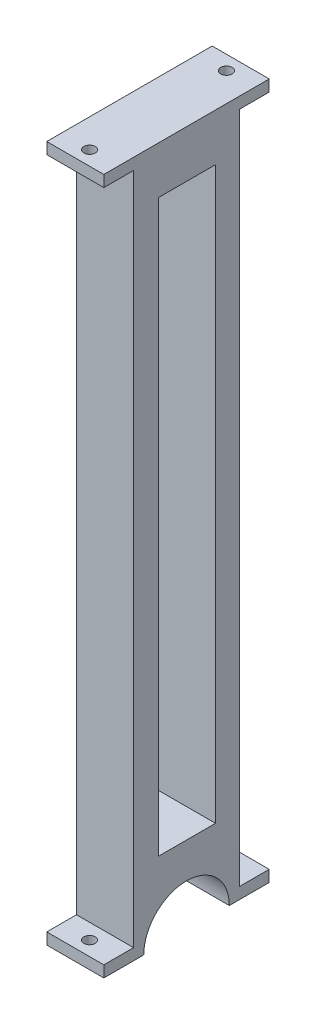
ISO-10303-21;
HEADER;
FILE_DESCRIPTION(('STEP AP214'),'2;1');
FILE_NAME('part.step','',(''),(''),'','','');
FILE_SCHEMA(('AUTOMOTIVE_DESIGN { 1 0 10303 214 1 1 1 1 }'));
ENDSEC;
DATA;
#1=APPLICATION_CONTEXT('core data for automotive mechanical design processes');
#2=APPLICATION_PROTOCOL_DEFINITION('international standard','automotive_design',2000,#1);
#3=PRODUCT_CONTEXT('',#1,'mechanical');
#4=PRODUCT('Part','Part','',(#3));
#5=PRODUCT_RELATED_PRODUCT_CATEGORY('part','',(#4));
#6=PRODUCT_DEFINITION_FORMATION('','',#4);
#7=PRODUCT_DEFINITION_CONTEXT('part definition',#1,'design');
#8=PRODUCT_DEFINITION('design','',#6,#7);
#9=PRODUCT_DEFINITION_SHAPE('','',#8);
#10=(LENGTH_UNIT() NAMED_UNIT(*) SI_UNIT(.MILLI.,.METRE.));
#11=(NAMED_UNIT(*) PLANE_ANGLE_UNIT() SI_UNIT($,.RADIAN.));
#12=(NAMED_UNIT(*) SI_UNIT($,.STERADIAN.) SOLID_ANGLE_UNIT());
#13=UNCERTAINTY_MEASURE_WITH_UNIT(LENGTH_MEASURE(1.E-05),#10,'distance_accuracy_value','');
#14=(GEOMETRIC_REPRESENTATION_CONTEXT(3) GLOBAL_UNCERTAINTY_ASSIGNED_CONTEXT((#13)) GLOBAL_UNIT_ASSIGNED_CONTEXT((#10,
#11,#12)) REPRESENTATION_CONTEXT('',''));
#15=CARTESIAN_POINT('',(0.,0.,0.));
#16=DIRECTION('',(0.,0.,1.));
#17=DIRECTION('',(1.,0.,0.));
#18=AXIS2_PLACEMENT_3D('',#15,#16,#17);
#19=CARTESIAN_POINT('',(10.,2.,14.5));
#20=DIRECTION('',(0.,1.,0.));
#21=DIRECTION('',(0.,0.,1.));
#22=AXIS2_PLACEMENT_3D('',#19,#20,#21);
#23=PLANE('',#22);
#24=CARTESIAN_POINT('',(5.,2.,12.));
#25=DIRECTION('',(0.,1.,0.));
#26=DIRECTION('',(0.,0.,1.));
#27=AXIS2_PLACEMENT_3D('',#24,#25,#26);
#28=CIRCLE('',#27,1.);
#29=CARTESIAN_POINT('',(5.,2.,13.));
#30=VERTEX_POINT('',#29);
#31=EDGE_CURVE('E379',#30,#30,#28,.T.);
#32=ORIENTED_EDGE('',*,*,#31,.F.);
#33=EDGE_LOOP('',(#32));
#34=FACE_BOUND('',#33,.T.);
#35=DIRECTION('',(0.,0.,-1.));
#36=VECTOR('',#35,1.);
#37=CARTESIAN_POINT('',(0.,2.,14.5));
#38=LINE('',#37,#36);
#39=CARTESIAN_POINT('',(0.,2.,14.5));
#40=VERTEX_POINT('',#39);
#41=CARTESIAN_POINT('',(0.,2.,9.28708781050335));
#42=VERTEX_POINT('',#41);
#43=EDGE_CURVE('E198',#40,#42,#38,.T.);
#44=ORIENTED_EDGE('',*,*,#43,.F.);
#45=DIRECTION('',(-1.,0.,0.));
#46=VECTOR('',#45,1.);
#47=CARTESIAN_POINT('',(10.,2.,14.5));
#48=LINE('',#47,#46);
#49=CARTESIAN_POINT('',(10.,2.,14.5));
#50=VERTEX_POINT('',#49);
#51=EDGE_CURVE('E11',#50,#40,#48,.T.);
#52=ORIENTED_EDGE('',*,*,#51,.F.);
#53=DIRECTION('',(0.,0.,-1.));
#54=VECTOR('',#53,1.);
#55=CARTESIAN_POINT('',(10.,2.,14.5));
#56=LINE('',#55,#54);
#57=CARTESIAN_POINT('',(10.,2.,9.28708781050335));
#58=VERTEX_POINT('',#57);
#59=EDGE_CURVE('E202',#50,#58,#56,.T.);
#60=ORIENTED_EDGE('',*,*,#59,.T.);
#61=DIRECTION('',(-1.,0.,0.));
#62=VECTOR('',#61,1.);
#63=CARTESIAN_POINT('',(10.,2.,9.28708781050335));
#64=LINE('',#63,#62);
#65=EDGE_CURVE('E39',#58,#42,#64,.T.);
#66=ORIENTED_EDGE('',*,*,#65,.T.);
#67=EDGE_LOOP('',(#44,#52,#60,#66));
#68=FACE_BOUND('',#67,.T.);
#69=ADVANCED_FACE('F36',(#34,#68),#23,.T.);
#70=CARTESIAN_POINT('',(10.,0.,14.5));
#71=DIRECTION('',(0.,0.,1.));
#72=DIRECTION('',(1.,0.,0.));
#73=AXIS2_PLACEMENT_3D('',#70,#71,#72);
#74=PLANE('',#73);
#75=DIRECTION('',(0.,1.,0.));
#76=VECTOR('',#75,1.);
#77=CARTESIAN_POINT('',(0.,0.,14.5));
#78=LINE('',#77,#76);
#79=CARTESIAN_POINT('',(0.,0.,14.5));
#80=VERTEX_POINT('',#79);
#81=EDGE_CURVE('E206',#80,#40,#78,.T.);
#82=ORIENTED_EDGE('',*,*,#81,.F.);
#83=DIRECTION('',(-1.,0.,0.));
#84=VECTOR('',#83,1.);
#85=CARTESIAN_POINT('',(10.,0.,14.5));
#86=LINE('',#85,#84);
#87=CARTESIAN_POINT('',(10.,0.,14.5));
#88=VERTEX_POINT('',#87);
#89=EDGE_CURVE('E44',#88,#80,#86,.T.);
#90=ORIENTED_EDGE('',*,*,#89,.F.);
#91=DIRECTION('',(0.,1.,0.));
#92=VECTOR('',#91,1.);
#93=CARTESIAN_POINT('',(10.,0.,14.5));
#94=LINE('',#93,#92);
#95=EDGE_CURVE('E234',#88,#50,#94,.T.);
#96=ORIENTED_EDGE('',*,*,#95,.T.);
#97=ORIENTED_EDGE('',*,*,#51,.T.);
#98=EDGE_LOOP('',(#82,#90,#96,#97));
#99=FACE_BOUND('',#98,.T.);
#100=ADVANCED_FACE('F312',(#99),#74,.T.);
#101=CARTESIAN_POINT('',(10.,0.,7.5));
#102=DIRECTION('',(0.,-1.,0.));
#103=DIRECTION('',(0.,0.,-1.));
#104=AXIS2_PLACEMENT_3D('',#101,#102,#103);
#105=PLANE('',#104);
#106=CARTESIAN_POINT('',(5.,0.,12.));
#107=DIRECTION('',(0.,1.,0.));
#108=DIRECTION('',(0.,0.,1.));
#109=AXIS2_PLACEMENT_3D('',#106,#107,#108);
#110=CIRCLE('',#109,1.);
#111=CARTESIAN_POINT('',(5.,0.,13.));
#112=VERTEX_POINT('',#111);
#113=EDGE_CURVE('E381',#112,#112,#110,.T.);
#114=ORIENTED_EDGE('',*,*,#113,.T.);
#115=EDGE_LOOP('',(#114));
#116=FACE_BOUND('',#115,.T.);
#117=DIRECTION('',(0.,0.,1.));
#118=VECTOR('',#117,1.);
#119=CARTESIAN_POINT('',(0.,0.,7.5));
#120=LINE('',#119,#118);
#121=CARTESIAN_POINT('',(0.,0.,7.5));
#122=VERTEX_POINT('',#121);
#123=EDGE_CURVE('E267',#122,#80,#120,.T.);
#124=ORIENTED_EDGE('',*,*,#123,.F.);
#125=DIRECTION('',(-1.,0.,0.));
#126=VECTOR('',#125,1.);
#127=CARTESIAN_POINT('',(10.,0.,7.5));
#128=LINE('',#127,#126);
#129=CARTESIAN_POINT('',(10.,0.,7.5));
#130=VERTEX_POINT('',#129);
#131=EDGE_CURVE('E273',#130,#122,#128,.T.);
#132=ORIENTED_EDGE('',*,*,#131,.F.);
#133=DIRECTION('',(0.,0.,1.));
#134=VECTOR('',#133,1.);
#135=CARTESIAN_POINT('',(10.,0.,7.5));
#136=LINE('',#135,#134);
#137=EDGE_CURVE('E231',#130,#88,#136,.T.);
#138=ORIENTED_EDGE('',*,*,#137,.T.);
#139=ORIENTED_EDGE('',*,*,#89,.T.);
#140=EDGE_LOOP('',(#124,#132,#138,#139));
#141=FACE_BOUND('',#140,.T.);
#142=ADVANCED_FACE('F362',(#116,#141),#105,.T.);
#143=CARTESIAN_POINT('',(10.,0.,0.));
#144=DIRECTION('',(-1.,0.,0.));
#145=DIRECTION('',(0.,0.,1.));
#146=AXIS2_PLACEMENT_3D('',#143,#144,#145);
#147=CYLINDRICAL_SURFACE('',#146,7.5);
#148=CARTESIAN_POINT('',(0.,0.,0.));
#149=DIRECTION('',(-1.,0.,0.));
#150=DIRECTION('',(0.,0.,1.));
#151=AXIS2_PLACEMENT_3D('',#148,#149,#150);
#152=CIRCLE('',#151,7.5);
#153=CARTESIAN_POINT('',(0.,0.,-7.5));
#154=VERTEX_POINT('',#153);
#155=EDGE_CURVE('E265',#122,#154,#152,.T.);
#156=ORIENTED_EDGE('',*,*,#155,.T.);
#157=DIRECTION('',(-1.,0.,0.));
#158=VECTOR('',#157,1.);
#159=CARTESIAN_POINT('',(10.,0.,-7.5));
#160=LINE('',#159,#158);
#161=CARTESIAN_POINT('',(10.,0.,-7.5));
#162=VERTEX_POINT('',#161);
#163=EDGE_CURVE('E275',#162,#154,#160,.T.);
#164=ORIENTED_EDGE('',*,*,#163,.F.);
#165=CARTESIAN_POINT('',(10.,0.,0.));
#166=DIRECTION('',(-1.,0.,0.));
#167=DIRECTION('',(0.,0.,1.));
#168=AXIS2_PLACEMENT_3D('',#165,#166,#167);
#169=CIRCLE('',#168,7.5);
#170=EDGE_CURVE('E229',#130,#162,#169,.T.);
#171=ORIENTED_EDGE('',*,*,#170,.F.);
#172=ORIENTED_EDGE('',*,*,#131,.T.);
#173=EDGE_LOOP('',(#156,#164,#171,#172));
#174=FACE_BOUND('',#173,.T.);
#175=ADVANCED_FACE('F360',(#174),#147,.F.);
#176=CARTESIAN_POINT('',(10.,0.,-7.5));
#177=DIRECTION('',(0.,1.,0.));
#178=DIRECTION('',(0.,0.,1.));
#179=AXIS2_PLACEMENT_3D('',#176,#177,#178);
#180=PLANE('',#179);
#181=CARTESIAN_POINT('',(5.,0.,-12.));
#182=DIRECTION('',(0.,1.,0.));
#183=DIRECTION('',(0.,0.,1.));
#184=AXIS2_PLACEMENT_3D('',#181,#182,#183);
#185=CIRCLE('',#184,1.);
#186=CARTESIAN_POINT('',(5.,0.,-11.));
#187=VERTEX_POINT('',#186);
#188=EDGE_CURVE('E192',#187,#187,#185,.T.);
#189=ORIENTED_EDGE('',*,*,#188,.T.);
#190=EDGE_LOOP('',(#189));
#191=FACE_BOUND('',#190,.T.);
#192=DIRECTION('',(0.,0.,-1.));
#193=VECTOR('',#192,1.);
#194=CARTESIAN_POINT('',(0.,0.,-7.5));
#195=LINE('',#194,#193);
#196=CARTESIAN_POINT('',(0.,0.,-14.5));
#197=VERTEX_POINT('',#196);
#198=EDGE_CURVE('E263',#154,#197,#195,.T.);
#199=ORIENTED_EDGE('',*,*,#198,.T.);
#200=DIRECTION('',(-1.,0.,0.));
#201=VECTOR('',#200,1.);
#202=CARTESIAN_POINT('',(10.,0.,-14.5));
#203=LINE('',#202,#201);
#204=CARTESIAN_POINT('',(10.,0.,-14.5));
#205=VERTEX_POINT('',#204);
#206=EDGE_CURVE('E278',#205,#197,#203,.T.);
#207=ORIENTED_EDGE('',*,*,#206,.F.);
#208=DIRECTION('',(0.,0.,-1.));
#209=VECTOR('',#208,1.);
#210=CARTESIAN_POINT('',(10.,0.,-7.5));
#211=LINE('',#210,#209);
#212=EDGE_CURVE('E227',#162,#205,#211,.T.);
#213=ORIENTED_EDGE('',*,*,#212,.F.);
#214=ORIENTED_EDGE('',*,*,#163,.T.);
#215=EDGE_LOOP('',(#199,#207,#213,#214));
#216=FACE_BOUND('',#215,.T.);
#217=ADVANCED_FACE('F356',(#191,#216),#180,.F.);
#218=CARTESIAN_POINT('',(10.,0.,-14.5));
#219=DIRECTION('',(0.,0.,1.));
#220=DIRECTION('',(1.,0.,0.));
#221=AXIS2_PLACEMENT_3D('',#218,#219,#220);
#222=PLANE('',#221);
#223=DIRECTION('',(0.,1.,0.));
#224=VECTOR('',#223,1.);
#225=CARTESIAN_POINT('',(0.,0.,-14.5));
#226=LINE('',#225,#224);
#227=CARTESIAN_POINT('',(0.,2.,-14.5));
#228=VERTEX_POINT('',#227);
#229=EDGE_CURVE('E261',#197,#228,#226,.T.);
#230=ORIENTED_EDGE('',*,*,#229,.T.);
#231=DIRECTION('',(-1.,0.,0.));
#232=VECTOR('',#231,1.);
#233=CARTESIAN_POINT('',(10.,2.,-14.5));
#234=LINE('',#233,#232);
#235=CARTESIAN_POINT('',(10.,2.,-14.5));
#236=VERTEX_POINT('',#235);
#237=EDGE_CURVE('E281',#236,#228,#234,.T.);
#238=ORIENTED_EDGE('',*,*,#237,.F.);
#239=DIRECTION('',(0.,1.,0.));
#240=VECTOR('',#239,1.);
#241=CARTESIAN_POINT('',(10.,0.,-14.5));
#242=LINE('',#241,#240);
#243=EDGE_CURVE('E225',#205,#236,#242,.T.);
#244=ORIENTED_EDGE('',*,*,#243,.F.);
#245=ORIENTED_EDGE('',*,*,#206,.T.);
#246=EDGE_LOOP('',(#230,#238,#244,#245));
#247=FACE_BOUND('',#246,.T.);
#248=ADVANCED_FACE('F351',(#247),#222,.F.);
#249=CARTESIAN_POINT('',(10.,2.,-14.5));
#250=DIRECTION('',(0.,-1.,0.));
#251=DIRECTION('',(0.,0.,-1.));
#252=AXIS2_PLACEMENT_3D('',#249,#250,#251);
#253=PLANE('',#252);
#254=CARTESIAN_POINT('',(5.,2.,-12.));
#255=DIRECTION('',(0.,1.,0.));
#256=DIRECTION('',(0.,0.,1.));
#257=AXIS2_PLACEMENT_3D('',#254,#255,#256);
#258=CIRCLE('',#257,1.);
#259=CARTESIAN_POINT('',(5.,2.,-11.));
#260=VERTEX_POINT('',#259);
#261=EDGE_CURVE('E185',#260,#260,#258,.T.);
#262=ORIENTED_EDGE('',*,*,#261,.F.);
#263=EDGE_LOOP('',(#262));
#264=FACE_BOUND('',#263,.T.);
#265=DIRECTION('',(0.,0.,1.));
#266=VECTOR('',#265,1.);
#267=CARTESIAN_POINT('',(0.,2.,-14.5));
#268=LINE('',#267,#266);
#269=CARTESIAN_POINT('',(0.,2.,-9.28708781050335));
#270=VERTEX_POINT('',#269);
#271=EDGE_CURVE('E259',#228,#270,#268,.T.);
#272=ORIENTED_EDGE('',*,*,#271,.T.);
#273=DIRECTION('',(-1.,0.,0.));
#274=VECTOR('',#273,1.);
#275=CARTESIAN_POINT('',(10.,2.,-9.28708781050335));
#276=LINE('',#275,#274);
#277=CARTESIAN_POINT('',(10.,2.,-9.28708781050335));
#278=VERTEX_POINT('',#277);
#279=EDGE_CURVE('E284',#278,#270,#276,.T.);
#280=ORIENTED_EDGE('',*,*,#279,.F.);
#281=DIRECTION('',(0.,0.,1.));
#282=VECTOR('',#281,1.);
#283=CARTESIAN_POINT('',(10.,2.,-14.5));
#284=LINE('',#283,#282);
#285=EDGE_CURVE('E223',#236,#278,#284,.T.);
#286=ORIENTED_EDGE('',*,*,#285,.F.);
#287=ORIENTED_EDGE('',*,*,#237,.T.);
#288=EDGE_LOOP('',(#272,#280,#286,#287));
#289=FACE_BOUND('',#288,.T.);
#290=ADVANCED_FACE('F346',(#264,#289),#253,.F.);
#291=CARTESIAN_POINT('',(10.,2.,-9.28708781050335));
#292=DIRECTION('',(0.,0.,1.));
#293=DIRECTION('',(1.,0.,0.));
#294=AXIS2_PLACEMENT_3D('',#291,#292,#293);
#295=PLANE('',#294);
#296=DIRECTION('',(0.,1.,0.));
#297=VECTOR('',#296,1.);
#298=CARTESIAN_POINT('',(0.,2.,-9.28708781050335));
#299=LINE('',#298,#297);
#300=CARTESIAN_POINT('',(0.,120.,-9.28708781050335));
#301=VERTEX_POINT('',#300);
#302=EDGE_CURVE('E256',#270,#301,#299,.T.);
#303=ORIENTED_EDGE('',*,*,#302,.T.);
#304=DIRECTION('',(-1.,0.,0.));
#305=VECTOR('',#304,1.);
#306=CARTESIAN_POINT('',(10.,120.,-9.28708781050335));
#307=LINE('',#306,#305);
#308=CARTESIAN_POINT('',(10.,120.,-9.28708781050335));
#309=VERTEX_POINT('',#308);
#310=EDGE_CURVE('E287',#309,#301,#307,.T.);
#311=ORIENTED_EDGE('',*,*,#310,.F.);
#312=DIRECTION('',(0.,1.,0.));
#313=VECTOR('',#312,1.);
#314=CARTESIAN_POINT('',(10.,2.,-9.28708781050335));
#315=LINE('',#314,#313);
#316=EDGE_CURVE('E221',#278,#309,#315,.T.);
#317=ORIENTED_EDGE('',*,*,#316,.F.);
#318=ORIENTED_EDGE('',*,*,#279,.T.);
#319=EDGE_LOOP('',(#303,#311,#317,#318));
#320=FACE_BOUND('',#319,.T.);
#321=ADVANCED_FACE('F342',(#320),#295,.F.);
#322=CARTESIAN_POINT('',(10.,120.,-14.5));
#323=DIRECTION('',(0.,-1.,0.));
#324=DIRECTION('',(0.,0.,-1.));
#325=AXIS2_PLACEMENT_3D('',#322,#323,#324);
#326=PLANE('',#325);
#327=CARTESIAN_POINT('',(5.,120.,-12.));
#328=DIRECTION('',(0.,1.,0.));
#329=DIRECTION('',(0.,0.,1.));
#330=AXIS2_PLACEMENT_3D('',#327,#328,#329);
#331=CIRCLE('',#330,1.);
#332=CARTESIAN_POINT('',(5.,120.,-11.));
#333=VERTEX_POINT('',#332);
#334=EDGE_CURVE('E382',#333,#333,#331,.T.);
#335=ORIENTED_EDGE('',*,*,#334,.T.);
#336=EDGE_LOOP('',(#335));
#337=FACE_BOUND('',#336,.T.);
#338=DIRECTION('',(0.,0.,1.));
#339=VECTOR('',#338,1.);
#340=CARTESIAN_POINT('',(0.,120.,-14.5));
#341=LINE('',#340,#339);
#342=CARTESIAN_POINT('',(0.,120.,-14.5));
#343=VERTEX_POINT('',#342);
#344=EDGE_CURVE('E253',#343,#301,#341,.T.);
#345=ORIENTED_EDGE('',*,*,#344,.F.);
#346=DIRECTION('',(-1.,0.,0.));
#347=VECTOR('',#346,1.);
#348=CARTESIAN_POINT('',(10.,120.,-14.5));
#349=LINE('',#348,#347);
#350=CARTESIAN_POINT('',(10.,120.,-14.5));
#351=VERTEX_POINT('',#350);
#352=EDGE_CURVE('E289',#351,#343,#349,.T.);
#353=ORIENTED_EDGE('',*,*,#352,.F.);
#354=DIRECTION('',(0.,0.,1.));
#355=VECTOR('',#354,1.);
#356=CARTESIAN_POINT('',(10.,120.,-14.5));
#357=LINE('',#356,#355);
#358=EDGE_CURVE('E218',#351,#309,#357,.T.);
#359=ORIENTED_EDGE('',*,*,#358,.T.);
#360=ORIENTED_EDGE('',*,*,#310,.T.);
#361=EDGE_LOOP('',(#345,#353,#359,#360));
#362=FACE_BOUND('',#361,.T.);
#363=ADVANCED_FACE('F337',(#337,#362),#326,.T.);
#364=CARTESIAN_POINT('',(10.,122.,-14.5));
#365=DIRECTION('',(0.,0.,-1.));
#366=DIRECTION('',(-1.,0.,0.));
#367=AXIS2_PLACEMENT_3D('',#364,#365,#366);
#368=PLANE('',#367);
#369=DIRECTION('',(0.,-1.,0.));
#370=VECTOR('',#369,1.);
#371=CARTESIAN_POINT('',(0.,122.,-14.5));
#372=LINE('',#371,#370);
#373=CARTESIAN_POINT('',(0.,122.,-14.5));
#374=VERTEX_POINT('',#373);
#375=EDGE_CURVE('E250',#374,#343,#372,.T.);
#376=ORIENTED_EDGE('',*,*,#375,.F.);
#377=DIRECTION('',(-1.,0.,0.));
#378=VECTOR('',#377,1.);
#379=CARTESIAN_POINT('',(10.,122.,-14.5));
#380=LINE('',#379,#378);
#381=CARTESIAN_POINT('',(10.,122.,-14.5));
#382=VERTEX_POINT('',#381);
#383=EDGE_CURVE('E291',#382,#374,#380,.T.);
#384=ORIENTED_EDGE('',*,*,#383,.F.);
#385=DIRECTION('',(0.,-1.,0.));
#386=VECTOR('',#385,1.);
#387=CARTESIAN_POINT('',(10.,122.,-14.5));
#388=LINE('',#387,#386);
#389=EDGE_CURVE('E215',#382,#351,#388,.T.);
#390=ORIENTED_EDGE('',*,*,#389,.T.);
#391=ORIENTED_EDGE('',*,*,#352,.T.);
#392=EDGE_LOOP('',(#376,#384,#390,#391));
#393=FACE_BOUND('',#392,.T.);
#394=ADVANCED_FACE('F332',(#393),#368,.T.);
#395=CARTESIAN_POINT('',(10.,122.,-9.28708781050335));
#396=DIRECTION('',(0.,1.,0.));
#397=DIRECTION('',(0.,0.,1.));
#398=AXIS2_PLACEMENT_3D('',#395,#396,#397);
#399=PLANE('',#398);
#400=CARTESIAN_POINT('',(5.,122.,12.));
#401=DIRECTION('',(0.,1.,0.));
#402=DIRECTION('',(0.,0.,1.));
#403=AXIS2_PLACEMENT_3D('',#400,#401,#402);
#404=CIRCLE('',#403,1.);
#405=CARTESIAN_POINT('',(5.,122.,13.));
#406=VERTEX_POINT('',#405);
#407=EDGE_CURVE('E463',#406,#406,#404,.T.);
#408=ORIENTED_EDGE('',*,*,#407,.F.);
#409=EDGE_LOOP('',(#408));
#410=FACE_BOUND('',#409,.T.);
#411=CARTESIAN_POINT('',(5.,122.,-12.));
#412=DIRECTION('',(0.,1.,0.));
#413=DIRECTION('',(0.,0.,1.));
#414=AXIS2_PLACEMENT_3D('',#411,#412,#413);
#415=CIRCLE('',#414,1.);
#416=CARTESIAN_POINT('',(5.,122.,-11.));
#417=VERTEX_POINT('',#416);
#418=EDGE_CURVE('E386',#417,#417,#415,.T.);
#419=ORIENTED_EDGE('',*,*,#418,.F.);
#420=EDGE_LOOP('',(#419));
#421=FACE_BOUND('',#420,.T.);
#422=DIRECTION('',(0.,0.,-1.));
#423=VECTOR('',#422,1.);
#424=CARTESIAN_POINT('',(0.,122.,-9.28708781050335));
#425=LINE('',#424,#423);
#426=CARTESIAN_POINT('',(0.,122.,14.5));
#427=VERTEX_POINT('',#426);
#428=EDGE_CURVE('E247',#427,#374,#425,.T.);
#429=ORIENTED_EDGE('',*,*,#428,.F.);
#430=DIRECTION('',(-1.,0.,0.));
#431=VECTOR('',#430,1.);
#432=CARTESIAN_POINT('',(10.,122.,14.5));
#433=LINE('',#432,#431);
#434=CARTESIAN_POINT('',(10.,122.,14.5));
#435=VERTEX_POINT('',#434);
#436=EDGE_CURVE('E293',#435,#427,#433,.T.);
#437=ORIENTED_EDGE('',*,*,#436,.F.);
#438=DIRECTION('',(0.,0.,-1.));
#439=VECTOR('',#438,1.);
#440=CARTESIAN_POINT('',(10.,122.,14.5));
#441=LINE('',#440,#439);
#442=EDGE_CURVE('E213',#435,#382,#441,.T.);
#443=ORIENTED_EDGE('',*,*,#442,.T.);
#444=ORIENTED_EDGE('',*,*,#383,.T.);
#445=EDGE_LOOP('',(#429,#437,#443,#444));
#446=FACE_BOUND('',#445,.T.);
#447=ADVANCED_FACE('F327',(#410,#421,#446),#399,.T.);
#448=CARTESIAN_POINT('',(10.,122.,14.5));
#449=DIRECTION('',(0.,0.,-1.));
#450=DIRECTION('',(-1.,0.,0.));
#451=AXIS2_PLACEMENT_3D('',#448,#449,#450);
#452=PLANE('',#451);
#453=DIRECTION('',(0.,-1.,0.));
#454=VECTOR('',#453,1.);
#455=CARTESIAN_POINT('',(0.,122.,14.5));
#456=LINE('',#455,#454);
#457=CARTESIAN_POINT('',(0.,120.,14.5));
#458=VERTEX_POINT('',#457);
#459=EDGE_CURVE('E245',#427,#458,#456,.T.);
#460=ORIENTED_EDGE('',*,*,#459,.T.);
#461=DIRECTION('',(-1.,0.,0.));
#462=VECTOR('',#461,1.);
#463=CARTESIAN_POINT('',(10.,120.,14.5));
#464=LINE('',#463,#462);
#465=CARTESIAN_POINT('',(10.,120.,14.5));
#466=VERTEX_POINT('',#465);
#467=EDGE_CURVE('E296',#466,#458,#464,.T.);
#468=ORIENTED_EDGE('',*,*,#467,.F.);
#469=DIRECTION('',(0.,-1.,0.));
#470=VECTOR('',#469,1.);
#471=CARTESIAN_POINT('',(10.,122.,14.5));
#472=LINE('',#471,#470);
#473=EDGE_CURVE('E211',#435,#466,#472,.T.);
#474=ORIENTED_EDGE('',*,*,#473,.F.);
#475=ORIENTED_EDGE('',*,*,#436,.T.);
#476=EDGE_LOOP('',(#460,#468,#474,#475));
#477=FACE_BOUND('',#476,.T.);
#478=ADVANCED_FACE('F325',(#477),#452,.F.);
#479=CARTESIAN_POINT('',(10.,120.,14.5));
#480=DIRECTION('',(0.,1.,0.));
#481=DIRECTION('',(0.,0.,1.));
#482=AXIS2_PLACEMENT_3D('',#479,#480,#481);
#483=PLANE('',#482);
#484=CARTESIAN_POINT('',(5.,120.,12.));
#485=DIRECTION('',(0.,1.,0.));
#486=DIRECTION('',(0.,0.,1.));
#487=AXIS2_PLACEMENT_3D('',#484,#485,#486);
#488=CIRCLE('',#487,1.);
#489=CARTESIAN_POINT('',(5.,120.,13.));
#490=VERTEX_POINT('',#489);
#491=EDGE_CURVE('E460',#490,#490,#488,.T.);
#492=ORIENTED_EDGE('',*,*,#491,.T.);
#493=EDGE_LOOP('',(#492));
#494=FACE_BOUND('',#493,.T.);
#495=DIRECTION('',(0.,0.,-1.));
#496=VECTOR('',#495,1.);
#497=CARTESIAN_POINT('',(0.,120.,14.5));
#498=LINE('',#497,#496);
#499=CARTESIAN_POINT('',(0.,120.,9.28708781050335));
#500=VERTEX_POINT('',#499);
#501=EDGE_CURVE('E242',#458,#500,#498,.T.);
#502=ORIENTED_EDGE('',*,*,#501,.T.);
#503=DIRECTION('',(-1.,0.,0.));
#504=VECTOR('',#503,1.);
#505=CARTESIAN_POINT('',(10.,120.,9.28708781050335));
#506=LINE('',#505,#504);
#507=CARTESIAN_POINT('',(10.,120.,9.28708781050335));
#508=VERTEX_POINT('',#507);
#509=EDGE_CURVE('E298',#508,#500,#506,.T.);
#510=ORIENTED_EDGE('',*,*,#509,.F.);
#511=DIRECTION('',(0.,0.,-1.));
#512=VECTOR('',#511,1.);
#513=CARTESIAN_POINT('',(10.,120.,14.5));
#514=LINE('',#513,#512);
#515=EDGE_CURVE('E209',#466,#508,#514,.T.);
#516=ORIENTED_EDGE('',*,*,#515,.F.);
#517=ORIENTED_EDGE('',*,*,#467,.T.);
#518=EDGE_LOOP('',(#502,#510,#516,#517));
#519=FACE_BOUND('',#518,.T.);
#520=ADVANCED_FACE('F322',(#494,#519),#483,.F.);
#521=CARTESIAN_POINT('',(10.,2.,9.28708781050335));
#522=DIRECTION('',(0.,0.,1.));
#523=DIRECTION('',(1.,0.,0.));
#524=AXIS2_PLACEMENT_3D('',#521,#522,#523);
#525=PLANE('',#524);
#526=DIRECTION('',(0.,1.,0.));
#527=VECTOR('',#526,1.);
#528=CARTESIAN_POINT('',(0.,2.,9.28708781050335));
#529=LINE('',#528,#527);
#530=EDGE_CURVE('E239',#42,#500,#529,.T.);
#531=ORIENTED_EDGE('',*,*,#530,.F.);
#532=ORIENTED_EDGE('',*,*,#65,.F.);
#533=DIRECTION('',(0.,1.,0.));
#534=VECTOR('',#533,1.);
#535=CARTESIAN_POINT('',(10.,2.,9.28708781050335));
#536=LINE('',#535,#534);
#537=EDGE_CURVE('E205',#58,#508,#536,.T.);
#538=ORIENTED_EDGE('',*,*,#537,.T.);
#539=ORIENTED_EDGE('',*,*,#509,.T.);
#540=EDGE_LOOP('',(#531,#532,#538,#539));
#541=FACE_BOUND('',#540,.T.);
#542=ADVANCED_FACE('F306',(#541),#525,.T.);
#543=CARTESIAN_POINT('',(10.,0.,0.));
#544=DIRECTION('',(-1.,0.,0.));
#545=DIRECTION('',(0.,0.,1.));
#546=AXIS2_PLACEMENT_3D('',#543,#544,#545);
#547=PLANE('',#546);
#548=DIRECTION('',(0.,1.,0.));
#549=VECTOR('',#548,1.);
#550=CARTESIAN_POINT('',(10.,13.69655508163,-5.07795464236118));
#551=LINE('',#550,#549);
#552=CARTESIAN_POINT('',(10.,13.69655508163,-5.07795464236118));
#553=VERTEX_POINT('',#552);
#554=CARTESIAN_POINT('',(10.,113.69655508163,-5.07795464236118));
#555=VERTEX_POINT('',#554);
#556=EDGE_CURVE('E191',#553,#555,#551,.T.);
#557=ORIENTED_EDGE('',*,*,#556,.F.);
#558=DIRECTION('',(0.,0.,-1.));
#559=VECTOR('',#558,1.);
#560=CARTESIAN_POINT('',(10.,13.69655508163,4.92204535763882));
#561=LINE('',#560,#559);
#562=CARTESIAN_POINT('',(10.,13.69655508163,4.92204535763882));
#563=VERTEX_POINT('',#562);
#564=EDGE_CURVE('E52',#563,#553,#561,.T.);
#565=ORIENTED_EDGE('',*,*,#564,.F.);
#566=DIRECTION('',(0.,-1.,0.));
#567=VECTOR('',#566,1.);
#568=CARTESIAN_POINT('',(10.,13.69655508163,4.92204535763882));
#569=LINE('',#568,#567);
#570=CARTESIAN_POINT('',(10.,113.69655508163,4.92204535763882));
#571=VERTEX_POINT('',#570);
#572=EDGE_CURVE('E179',#571,#563,#569,.T.);
#573=ORIENTED_EDGE('',*,*,#572,.F.);
#574=DIRECTION('',(0.,0.,1.));
#575=VECTOR('',#574,1.);
#576=CARTESIAN_POINT('',(10.,113.69655508163,4.92204535763882));
#577=LINE('',#576,#575);
#578=EDGE_CURVE('E182',#555,#571,#577,.T.);
#579=ORIENTED_EDGE('',*,*,#578,.F.);
#580=EDGE_LOOP('',(#557,#565,#573,#579));
#581=FACE_BOUND('',#580,.T.);
#582=ORIENTED_EDGE('',*,*,#59,.F.);
#583=ORIENTED_EDGE('',*,*,#95,.F.);
#584=ORIENTED_EDGE('',*,*,#137,.F.);
#585=ORIENTED_EDGE('',*,*,#170,.T.);
#586=ORIENTED_EDGE('',*,*,#212,.T.);
#587=ORIENTED_EDGE('',*,*,#243,.T.);
#588=ORIENTED_EDGE('',*,*,#285,.T.);
#589=ORIENTED_EDGE('',*,*,#316,.T.);
#590=ORIENTED_EDGE('',*,*,#358,.F.);
#591=ORIENTED_EDGE('',*,*,#389,.F.);
#592=ORIENTED_EDGE('',*,*,#442,.F.);
#593=ORIENTED_EDGE('',*,*,#473,.T.);
#594=ORIENTED_EDGE('',*,*,#515,.T.);
#595=ORIENTED_EDGE('',*,*,#537,.F.);
#596=EDGE_LOOP('',(#582,#583,#584,#585,#586,#587,#588,#589,#590,#591,#592,#593,#594,#595));
#597=FACE_BOUND('',#596,.T.);
#598=ADVANCED_FACE('F315',(#581,#597),#547,.F.);
#599=CARTESIAN_POINT('',(0.,0.,0.));
#600=DIRECTION('',(-1.,0.,0.));
#601=DIRECTION('',(0.,0.,1.));
#602=AXIS2_PLACEMENT_3D('',#599,#600,#601);
#603=PLANE('',#602);
#604=DIRECTION('',(0.,0.,-1.));
#605=VECTOR('',#604,1.);
#606=CARTESIAN_POINT('',(0.,13.69655508163,4.92204535763882));
#607=LINE('',#606,#605);
#608=CARTESIAN_POINT('',(0.,13.69655508163,4.92204535763882));
#609=VERTEX_POINT('',#608);
#610=CARTESIAN_POINT('',(0.,13.69655508163,-5.07795464236118));
#611=VERTEX_POINT('',#610);
#612=EDGE_CURVE('E163',#609,#611,#607,.T.);
#613=ORIENTED_EDGE('',*,*,#612,.T.);
#614=DIRECTION('',(0.,1.,0.));
#615=VECTOR('',#614,1.);
#616=CARTESIAN_POINT('',(0.,13.69655508163,-5.07795464236118));
#617=LINE('',#616,#615);
#618=CARTESIAN_POINT('',(0.,113.69655508163,-5.07795464236118));
#619=VERTEX_POINT('',#618);
#620=EDGE_CURVE('E172',#611,#619,#617,.T.);
#621=ORIENTED_EDGE('',*,*,#620,.T.);
#622=DIRECTION('',(0.,0.,1.));
#623=VECTOR('',#622,1.);
#624=CARTESIAN_POINT('',(0.,113.69655508163,4.92204535763882));
#625=LINE('',#624,#623);
#626=CARTESIAN_POINT('',(0.,113.69655508163,4.92204535763882));
#627=VERTEX_POINT('',#626);
#628=EDGE_CURVE('E60',#619,#627,#625,.T.);
#629=ORIENTED_EDGE('',*,*,#628,.T.);
#630=DIRECTION('',(0.,-1.,0.));
#631=VECTOR('',#630,1.);
#632=CARTESIAN_POINT('',(0.,13.69655508163,4.92204535763882));
#633=LINE('',#632,#631);
#634=EDGE_CURVE('E169',#627,#609,#633,.T.);
#635=ORIENTED_EDGE('',*,*,#634,.T.);
#636=EDGE_LOOP('',(#613,#621,#629,#635));
#637=FACE_BOUND('',#636,.T.);
#638=ORIENTED_EDGE('',*,*,#43,.T.);
#639=ORIENTED_EDGE('',*,*,#530,.T.);
#640=ORIENTED_EDGE('',*,*,#501,.F.);
#641=ORIENTED_EDGE('',*,*,#459,.F.);
#642=ORIENTED_EDGE('',*,*,#428,.T.);
#643=ORIENTED_EDGE('',*,*,#375,.T.);
#644=ORIENTED_EDGE('',*,*,#344,.T.);
#645=ORIENTED_EDGE('',*,*,#302,.F.);
#646=ORIENTED_EDGE('',*,*,#271,.F.);
#647=ORIENTED_EDGE('',*,*,#229,.F.);
#648=ORIENTED_EDGE('',*,*,#198,.F.);
#649=ORIENTED_EDGE('',*,*,#155,.F.);
#650=ORIENTED_EDGE('',*,*,#123,.T.);
#651=ORIENTED_EDGE('',*,*,#81,.T.);
#652=EDGE_LOOP('',(#638,#639,#640,#641,#642,#643,#644,#645,#646,#647,#648,#649,#650,#651));
#653=FACE_BOUND('',#652,.T.);
#654=ADVANCED_FACE('F176',(#637,#653),#603,.T.);
#655=CARTESIAN_POINT('',(0.,13.69655508163,4.92204535763882));
#656=DIRECTION('',(0.,-1.,0.));
#657=DIRECTION('',(0.,0.,-1.));
#658=AXIS2_PLACEMENT_3D('',#655,#656,#657);
#659=PLANE('',#658);
#660=ORIENTED_EDGE('',*,*,#564,.T.);
#661=DIRECTION('',(1.,0.,0.));
#662=VECTOR('',#661,1.);
#663=CARTESIAN_POINT('',(0.,13.69655508163,-5.07795464236118));
#664=LINE('',#663,#662);
#665=EDGE_CURVE('E159',#611,#553,#664,.T.);
#666=ORIENTED_EDGE('',*,*,#665,.F.);
#667=ORIENTED_EDGE('',*,*,#612,.F.);
#668=DIRECTION('',(1.,0.,0.));
#669=VECTOR('',#668,1.);
#670=CARTESIAN_POINT('',(0.,13.69655508163,4.92204535763882));
#671=LINE('',#670,#669);
#672=EDGE_CURVE('E196',#609,#563,#671,.T.);
#673=ORIENTED_EDGE('',*,*,#672,.T.);
#674=EDGE_LOOP('',(#660,#666,#667,#673));
#675=FACE_BOUND('',#674,.T.);
#676=ADVANCED_FACE('F161',(#675),#659,.F.);
#677=CARTESIAN_POINT('',(0.,13.69655508163,4.92204535763882));
#678=DIRECTION('',(0.,0.,1.));
#679=DIRECTION('',(1.,0.,0.));
#680=AXIS2_PLACEMENT_3D('',#677,#678,#679);
#681=PLANE('',#680);
#682=ORIENTED_EDGE('',*,*,#572,.T.);
#683=ORIENTED_EDGE('',*,*,#672,.F.);
#684=ORIENTED_EDGE('',*,*,#634,.F.);
#685=DIRECTION('',(1.,0.,0.));
#686=VECTOR('',#685,1.);
#687=CARTESIAN_POINT('',(0.,113.69655508163,4.92204535763882));
#688=LINE('',#687,#686);
#689=EDGE_CURVE('E199',#627,#571,#688,.T.);
#690=ORIENTED_EDGE('',*,*,#689,.T.);
#691=EDGE_LOOP('',(#682,#683,#684,#690));
#692=FACE_BOUND('',#691,.T.);
#693=ADVANCED_FACE('F432',(#692),#681,.F.);
#694=CARTESIAN_POINT('',(0.,113.69655508163,4.92204535763882));
#695=DIRECTION('',(0.,1.,0.));
#696=DIRECTION('',(0.,0.,1.));
#697=AXIS2_PLACEMENT_3D('',#694,#695,#696);
#698=PLANE('',#697);
#699=ORIENTED_EDGE('',*,*,#578,.T.);
#700=ORIENTED_EDGE('',*,*,#689,.F.);
#701=ORIENTED_EDGE('',*,*,#628,.F.);
#702=DIRECTION('',(1.,0.,0.));
#703=VECTOR('',#702,1.);
#704=CARTESIAN_POINT('',(0.,113.69655508163,-5.07795464236118));
#705=LINE('',#704,#703);
#706=EDGE_CURVE('E168',#619,#555,#705,.T.);
#707=ORIENTED_EDGE('',*,*,#706,.T.);
#708=EDGE_LOOP('',(#699,#700,#701,#707));
#709=FACE_BOUND('',#708,.T.);
#710=ADVANCED_FACE('F435',(#709),#698,.F.);
#711=CARTESIAN_POINT('',(0.,13.69655508163,-5.07795464236118));
#712=DIRECTION('',(0.,0.,-1.));
#713=DIRECTION('',(-1.,0.,0.));
#714=AXIS2_PLACEMENT_3D('',#711,#712,#713);
#715=PLANE('',#714);
#716=ORIENTED_EDGE('',*,*,#556,.T.);
#717=ORIENTED_EDGE('',*,*,#706,.F.);
#718=ORIENTED_EDGE('',*,*,#620,.F.);
#719=ORIENTED_EDGE('',*,*,#665,.T.);
#720=EDGE_LOOP('',(#716,#717,#718,#719));
#721=FACE_BOUND('',#720,.T.);
#722=ADVANCED_FACE('F173',(#721),#715,.F.);
#723=CARTESIAN_POINT('',(5.,0.,-12.));
#724=DIRECTION('',(0.,1.,0.));
#725=DIRECTION('',(0.,0.,1.));
#726=AXIS2_PLACEMENT_3D('',#723,#724,#725);
#727=CYLINDRICAL_SURFACE('',#726,1.);
#728=ORIENTED_EDGE('',*,*,#188,.F.);
#729=EDGE_LOOP('',(#728));
#730=FACE_BOUND('',#729,.T.);
#731=ORIENTED_EDGE('',*,*,#261,.T.);
#732=EDGE_LOOP('',(#731));
#733=FACE_BOUND('',#732,.T.);
#734=ADVANCED_FACE('F395',(#730,#733),#727,.F.);
#735=CARTESIAN_POINT('',(5.,0.,12.));
#736=DIRECTION('',(0.,1.,0.));
#737=DIRECTION('',(0.,0.,1.));
#738=AXIS2_PLACEMENT_3D('',#735,#736,#737);
#739=CYLINDRICAL_SURFACE('',#738,1.);
#740=ORIENTED_EDGE('',*,*,#113,.F.);
#741=EDGE_LOOP('',(#740));
#742=FACE_BOUND('',#741,.T.);
#743=ORIENTED_EDGE('',*,*,#31,.T.);
#744=EDGE_LOOP('',(#743));
#745=FACE_BOUND('',#744,.T.);
#746=ADVANCED_FACE('F443',(#742,#745),#739,.F.);
#747=CARTESIAN_POINT('',(5.,120.,-12.));
#748=DIRECTION('',(0.,1.,0.));
#749=DIRECTION('',(0.,0.,1.));
#750=AXIS2_PLACEMENT_3D('',#747,#748,#749);
#751=CYLINDRICAL_SURFACE('',#750,1.);
#752=ORIENTED_EDGE('',*,*,#334,.F.);
#753=EDGE_LOOP('',(#752));
#754=FACE_BOUND('',#753,.T.);
#755=ORIENTED_EDGE('',*,*,#418,.T.);
#756=EDGE_LOOP('',(#755));
#757=FACE_BOUND('',#756,.T.);
#758=ADVANCED_FACE('F447',(#754,#757),#751,.F.);
#759=CARTESIAN_POINT('',(5.,120.,12.));
#760=DIRECTION('',(0.,1.,0.));
#761=DIRECTION('',(0.,0.,1.));
#762=AXIS2_PLACEMENT_3D('',#759,#760,#761);
#763=CYLINDRICAL_SURFACE('',#762,1.);
#764=ORIENTED_EDGE('',*,*,#491,.F.);
#765=EDGE_LOOP('',(#764));
#766=FACE_BOUND('',#765,.T.);
#767=ORIENTED_EDGE('',*,*,#407,.T.);
#768=EDGE_LOOP('',(#767));
#769=FACE_BOUND('',#768,.T.);
#770=ADVANCED_FACE('F451',(#766,#769),#763,.F.);
#771=CLOSED_SHELL('',(#69,#100,#142,#175,#217,#248,#290,#321,#363,#394,#447,#478,#520,#542,#598,
#654,#676,#693,#710,#722,#734,#746,#758,#770));
#772=MANIFOLD_SOLID_BREP('B2',#771);
#773=ADVANCED_BREP_SHAPE_REPRESENTATION('',(#18,#772),#14);
#774=SHAPE_DEFINITION_REPRESENTATION(#9,#773);
ENDSEC;
END-ISO-10303-21;
